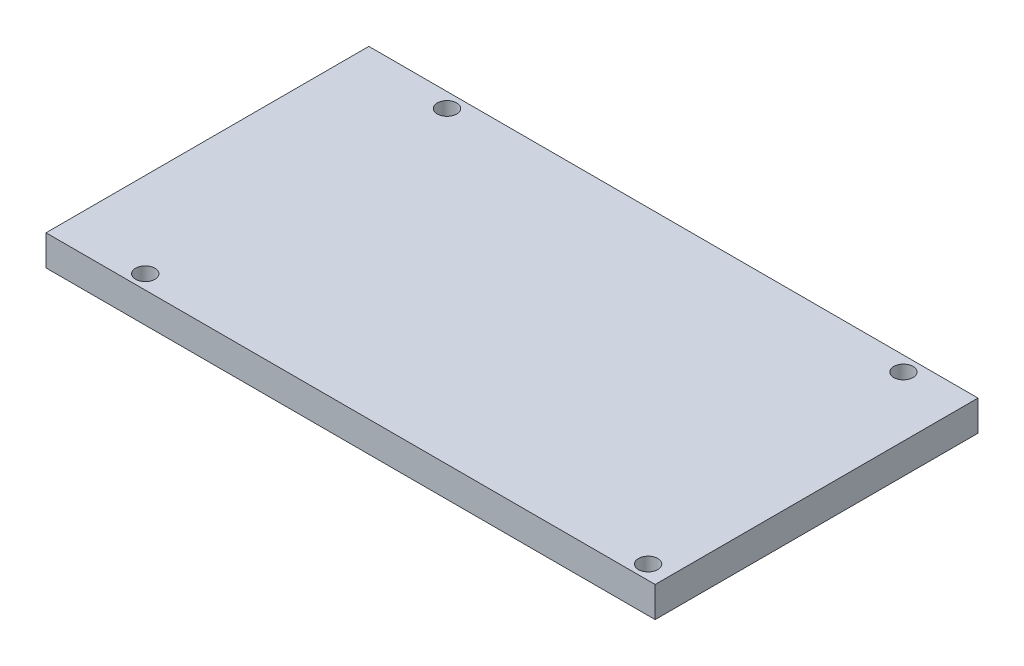
ISO-10303-21;
HEADER;
FILE_DESCRIPTION(('STEP AP214'),'2;1');
FILE_NAME('part.step','',(''),(''),'','','');
FILE_SCHEMA(('AUTOMOTIVE_DESIGN { 1 0 10303 214 1 1 1 1 }'));
ENDSEC;
DATA;
#1=APPLICATION_CONTEXT('core data for automotive mechanical design processes');
#2=APPLICATION_PROTOCOL_DEFINITION('international standard','automotive_design',2000,#1);
#3=PRODUCT_CONTEXT('',#1,'mechanical');
#4=PRODUCT('Part','Part','',(#3));
#5=PRODUCT_RELATED_PRODUCT_CATEGORY('part','',(#4));
#6=PRODUCT_DEFINITION_FORMATION('','',#4);
#7=PRODUCT_DEFINITION_CONTEXT('part definition',#1,'design');
#8=PRODUCT_DEFINITION('design','',#6,#7);
#9=PRODUCT_DEFINITION_SHAPE('','',#8);
#10=(LENGTH_UNIT() NAMED_UNIT(*) SI_UNIT(.MILLI.,.METRE.));
#11=(NAMED_UNIT(*) PLANE_ANGLE_UNIT() SI_UNIT($,.RADIAN.));
#12=(NAMED_UNIT(*) SI_UNIT($,.STERADIAN.) SOLID_ANGLE_UNIT());
#13=UNCERTAINTY_MEASURE_WITH_UNIT(LENGTH_MEASURE(1.E-05),#10,'distance_accuracy_value','');
#14=(GEOMETRIC_REPRESENTATION_CONTEXT(3) GLOBAL_UNCERTAINTY_ASSIGNED_CONTEXT((#13)) GLOBAL_UNIT_ASSIGNED_CONTEXT((#10,
#11,#12)) REPRESENTATION_CONTEXT('',''));
#15=CARTESIAN_POINT('',(0.,0.,0.));
#16=DIRECTION('',(0.,0.,1.));
#17=DIRECTION('',(1.,0.,0.));
#18=AXIS2_PLACEMENT_3D('',#15,#16,#17);
#19=CARTESIAN_POINT('',(50.,5.,26.5));
#20=DIRECTION('',(-1.,0.,0.));
#21=DIRECTION('',(0.,0.,1.));
#22=AXIS2_PLACEMENT_3D('',#19,#20,#21);
#23=PLANE('',#22);
#24=DIRECTION('',(0.,0.,-1.));
#25=VECTOR('',#24,1.);
#26=CARTESIAN_POINT('',(50.,0.,26.5));
#27=LINE('',#26,#25);
#28=CARTESIAN_POINT('',(50.,0.,26.5));
#29=VERTEX_POINT('',#28);
#30=CARTESIAN_POINT('',(50.,0.,-26.5));
#31=VERTEX_POINT('',#30);
#32=EDGE_CURVE('E106',#29,#31,#27,.T.);
#33=ORIENTED_EDGE('',*,*,#32,.T.);
#34=DIRECTION('',(0.,-1.,0.));
#35=VECTOR('',#34,1.);
#36=CARTESIAN_POINT('',(50.,5.,-26.5));
#37=LINE('',#36,#35);
#38=CARTESIAN_POINT('',(50.,5.,-26.5));
#39=VERTEX_POINT('',#38);
#40=EDGE_CURVE('E11',#39,#31,#37,.T.);
#41=ORIENTED_EDGE('',*,*,#40,.F.);
#42=DIRECTION('',(0.,0.,-1.));
#43=VECTOR('',#42,1.);
#44=CARTESIAN_POINT('',(50.,5.,26.5));
#45=LINE('',#44,#43);
#46=CARTESIAN_POINT('',(50.,5.,26.5));
#47=VERTEX_POINT('',#46);
#48=EDGE_CURVE('E90',#47,#39,#45,.T.);
#49=ORIENTED_EDGE('',*,*,#48,.F.);
#50=DIRECTION('',(0.,-1.,0.));
#51=VECTOR('',#50,1.);
#52=CARTESIAN_POINT('',(50.,5.,26.5));
#53=LINE('',#52,#51);
#54=EDGE_CURVE('E102',#47,#29,#53,.T.);
#55=ORIENTED_EDGE('',*,*,#54,.T.);
#56=EDGE_LOOP('',(#33,#41,#49,#55));
#57=FACE_BOUND('',#56,.T.);
#58=ADVANCED_FACE('F38',(#57),#23,.F.);
#59=CARTESIAN_POINT('',(-50.,5.,-26.5));
#60=DIRECTION('',(0.,0.,1.));
#61=DIRECTION('',(1.,0.,0.));
#62=AXIS2_PLACEMENT_3D('',#59,#60,#61);
#63=PLANE('',#62);
#64=DIRECTION('',(-1.,0.,0.));
#65=VECTOR('',#64,1.);
#66=CARTESIAN_POINT('',(-50.,0.,-26.5));
#67=LINE('',#66,#65);
#68=CARTESIAN_POINT('',(-50.,0.,-26.5));
#69=VERTEX_POINT('',#68);
#70=EDGE_CURVE('E95',#31,#69,#67,.T.);
#71=ORIENTED_EDGE('',*,*,#70,.T.);
#72=DIRECTION('',(0.,-1.,0.));
#73=VECTOR('',#72,1.);
#74=CARTESIAN_POINT('',(-50.,5.,-26.5));
#75=LINE('',#74,#73);
#76=CARTESIAN_POINT('',(-50.,5.,-26.5));
#77=VERTEX_POINT('',#76);
#78=EDGE_CURVE('E47',#77,#69,#75,.T.);
#79=ORIENTED_EDGE('',*,*,#78,.F.);
#80=DIRECTION('',(-1.,0.,0.));
#81=VECTOR('',#80,1.);
#82=CARTESIAN_POINT('',(-50.,5.,-26.5));
#83=LINE('',#82,#81);
#84=EDGE_CURVE('E85',#39,#77,#83,.T.);
#85=ORIENTED_EDGE('',*,*,#84,.F.);
#86=ORIENTED_EDGE('',*,*,#40,.T.);
#87=EDGE_LOOP('',(#71,#79,#85,#86));
#88=FACE_BOUND('',#87,.T.);
#89=ADVANCED_FACE('F94',(#88),#63,.F.);
#90=CARTESIAN_POINT('',(-50.,5.,26.5));
#91=DIRECTION('',(1.,0.,0.));
#92=DIRECTION('',(0.,0.,-1.));
#93=AXIS2_PLACEMENT_3D('',#90,#91,#92);
#94=PLANE('',#93);
#95=DIRECTION('',(0.,0.,1.));
#96=VECTOR('',#95,1.);
#97=CARTESIAN_POINT('',(-50.,0.,26.5));
#98=LINE('',#97,#96);
#99=CARTESIAN_POINT('',(-50.,0.,26.5));
#100=VERTEX_POINT('',#99);
#101=EDGE_CURVE('E72',#69,#100,#98,.T.);
#102=ORIENTED_EDGE('',*,*,#101,.T.);
#103=DIRECTION('',(0.,-1.,0.));
#104=VECTOR('',#103,1.);
#105=CARTESIAN_POINT('',(-50.,5.,26.5));
#106=LINE('',#105,#104);
#107=CARTESIAN_POINT('',(-50.,5.,26.5));
#108=VERTEX_POINT('',#107);
#109=EDGE_CURVE('E97',#108,#100,#106,.T.);
#110=ORIENTED_EDGE('',*,*,#109,.F.);
#111=DIRECTION('',(0.,0.,1.));
#112=VECTOR('',#111,1.);
#113=CARTESIAN_POINT('',(-50.,5.,26.5));
#114=LINE('',#113,#112);
#115=EDGE_CURVE('E88',#77,#108,#114,.T.);
#116=ORIENTED_EDGE('',*,*,#115,.F.);
#117=ORIENTED_EDGE('',*,*,#78,.T.);
#118=EDGE_LOOP('',(#102,#110,#116,#117));
#119=FACE_BOUND('',#118,.T.);
#120=ADVANCED_FACE('F98',(#119),#94,.F.);
#121=CARTESIAN_POINT('',(-50.,5.,26.5));
#122=DIRECTION('',(0.,0.,-1.));
#123=DIRECTION('',(-1.,0.,0.));
#124=AXIS2_PLACEMENT_3D('',#121,#122,#123);
#125=PLANE('',#124);
#126=DIRECTION('',(1.,0.,0.));
#127=VECTOR('',#126,1.);
#128=CARTESIAN_POINT('',(-50.,0.,26.5));
#129=LINE('',#128,#127);
#130=EDGE_CURVE('E78',#100,#29,#129,.T.);
#131=ORIENTED_EDGE('',*,*,#130,.T.);
#132=ORIENTED_EDGE('',*,*,#54,.F.);
#133=DIRECTION('',(1.,0.,0.));
#134=VECTOR('',#133,1.);
#135=CARTESIAN_POINT('',(-50.,5.,26.5));
#136=LINE('',#135,#134);
#137=EDGE_CURVE('E55',#108,#47,#136,.T.);
#138=ORIENTED_EDGE('',*,*,#137,.F.);
#139=ORIENTED_EDGE('',*,*,#109,.T.);
#140=EDGE_LOOP('',(#131,#132,#138,#139));
#141=FACE_BOUND('',#140,.T.);
#142=ADVANCED_FACE('F120',(#141),#125,.F.);
#143=CARTESIAN_POINT('',(0.,5.,0.));
#144=DIRECTION('',(0.,-1.,0.));
#145=DIRECTION('',(0.,0.,-1.));
#146=AXIS2_PLACEMENT_3D('',#143,#144,#145);
#147=PLANE('',#146);
#148=CARTESIAN_POINT('',(46.5199999999999,5.,24.1730000000002));
#149=DIRECTION('',(0.,-1.,0.));
#150=DIRECTION('',(0.,0.,-1.));
#151=AXIS2_PLACEMENT_3D('',#148,#149,#150);
#152=CIRCLE('',#151,1.5875);
#153=CARTESIAN_POINT('',(46.5199999999999,5.,22.5855000000002));
#154=VERTEX_POINT('',#153);
#155=EDGE_CURVE('E110',#154,#154,#152,.T.);
#156=ORIENTED_EDGE('',*,*,#155,.T.);
#157=EDGE_LOOP('',(#156));
#158=FACE_BOUND('',#157,.T.);
#159=CARTESIAN_POINT('',(40.17,5.,-24.0869999999998));
#160=DIRECTION('',(0.,-1.,0.));
#161=DIRECTION('',(0.,0.,-1.));
#162=AXIS2_PLACEMENT_3D('',#159,#160,#161);
#163=CIRCLE('',#162,1.5875);
#164=CARTESIAN_POINT('',(40.17,5.,-25.6744999999998));
#165=VERTEX_POINT('',#164);
#166=EDGE_CURVE('E147',#165,#165,#163,.T.);
#167=ORIENTED_EDGE('',*,*,#166,.T.);
#168=EDGE_LOOP('',(#167));
#169=FACE_BOUND('',#168,.T.);
#170=CARTESIAN_POINT('',(-34.76,5.,-24.087));
#171=DIRECTION('',(0.,-1.,0.));
#172=DIRECTION('',(0.,0.,-1.));
#173=AXIS2_PLACEMENT_3D('',#170,#171,#172);
#174=CIRCLE('',#173,1.5875);
#175=CARTESIAN_POINT('',(-34.76,5.,-25.6745));
#176=VERTEX_POINT('',#175);
#177=EDGE_CURVE('E139',#176,#176,#174,.T.);
#178=ORIENTED_EDGE('',*,*,#177,.T.);
#179=EDGE_LOOP('',(#178));
#180=FACE_BOUND('',#179,.T.);
#181=CARTESIAN_POINT('',(-36.0300000000001,5.,24.173));
#182=DIRECTION('',(0.,-1.,0.));
#183=DIRECTION('',(0.,0.,-1.));
#184=AXIS2_PLACEMENT_3D('',#181,#182,#183);
#185=CIRCLE('',#184,1.5875);
#186=CARTESIAN_POINT('',(-36.0300000000001,5.,22.5855));
#187=VERTEX_POINT('',#186);
#188=EDGE_CURVE('E131',#187,#187,#185,.T.);
#189=ORIENTED_EDGE('',*,*,#188,.T.);
#190=EDGE_LOOP('',(#189));
#191=FACE_BOUND('',#190,.T.);
#192=ORIENTED_EDGE('',*,*,#48,.T.);
#193=ORIENTED_EDGE('',*,*,#84,.T.);
#194=ORIENTED_EDGE('',*,*,#115,.T.);
#195=ORIENTED_EDGE('',*,*,#137,.T.);
#196=EDGE_LOOP('',(#192,#193,#194,#195));
#197=FACE_BOUND('',#196,.T.);
#198=ADVANCED_FACE('F86',(#158,#169,#180,#191,#197),#147,.F.);
#199=CARTESIAN_POINT('',(0.,0.,0.));
#200=DIRECTION('',(0.,-1.,0.));
#201=DIRECTION('',(0.,0.,-1.));
#202=AXIS2_PLACEMENT_3D('',#199,#200,#201);
#203=PLANE('',#202);
#204=CARTESIAN_POINT('',(46.5199999999999,0.,24.1730000000002));
#205=DIRECTION('',(0.,-1.,0.));
#206=DIRECTION('',(0.,0.,-1.));
#207=AXIS2_PLACEMENT_3D('',#204,#205,#206);
#208=CIRCLE('',#207,1.5875);
#209=CARTESIAN_POINT('',(46.5199999999999,0.,22.5855000000002));
#210=VERTEX_POINT('',#209);
#211=EDGE_CURVE('E151',#210,#210,#208,.T.);
#212=ORIENTED_EDGE('',*,*,#211,.F.);
#213=EDGE_LOOP('',(#212));
#214=FACE_BOUND('',#213,.T.);
#215=CARTESIAN_POINT('',(40.17,0.,-24.0869999999998));
#216=DIRECTION('',(0.,-1.,0.));
#217=DIRECTION('',(0.,0.,-1.));
#218=AXIS2_PLACEMENT_3D('',#215,#216,#217);
#219=CIRCLE('',#218,1.5875);
#220=CARTESIAN_POINT('',(40.17,0.,-25.6744999999998));
#221=VERTEX_POINT('',#220);
#222=EDGE_CURVE('E143',#221,#221,#219,.T.);
#223=ORIENTED_EDGE('',*,*,#222,.F.);
#224=EDGE_LOOP('',(#223));
#225=FACE_BOUND('',#224,.T.);
#226=CARTESIAN_POINT('',(-34.76,0.,-24.087));
#227=DIRECTION('',(0.,-1.,0.));
#228=DIRECTION('',(0.,0.,-1.));
#229=AXIS2_PLACEMENT_3D('',#226,#227,#228);
#230=CIRCLE('',#229,1.5875);
#231=CARTESIAN_POINT('',(-34.76,0.,-25.6745));
#232=VERTEX_POINT('',#231);
#233=EDGE_CURVE('E135',#232,#232,#230,.T.);
#234=ORIENTED_EDGE('',*,*,#233,.F.);
#235=EDGE_LOOP('',(#234));
#236=FACE_BOUND('',#235,.T.);
#237=CARTESIAN_POINT('',(-36.0300000000001,0.,24.173));
#238=DIRECTION('',(0.,-1.,0.));
#239=DIRECTION('',(0.,0.,-1.));
#240=AXIS2_PLACEMENT_3D('',#237,#238,#239);
#241=CIRCLE('',#240,1.5875);
#242=CARTESIAN_POINT('',(-36.0300000000001,0.,22.5855));
#243=VERTEX_POINT('',#242);
#244=EDGE_CURVE('E127',#243,#243,#241,.T.);
#245=ORIENTED_EDGE('',*,*,#244,.F.);
#246=EDGE_LOOP('',(#245));
#247=FACE_BOUND('',#246,.T.);
#248=ORIENTED_EDGE('',*,*,#32,.F.);
#249=ORIENTED_EDGE('',*,*,#130,.F.);
#250=ORIENTED_EDGE('',*,*,#101,.F.);
#251=ORIENTED_EDGE('',*,*,#70,.F.);
#252=EDGE_LOOP('',(#248,#249,#250,#251));
#253=FACE_BOUND('',#252,.T.);
#254=ADVANCED_FACE('F123',(#214,#225,#236,#247,#253),#203,.T.);
#255=CARTESIAN_POINT('',(-36.0300000000001,5.,24.173));
#256=DIRECTION('',(0.,-1.,0.));
#257=DIRECTION('',(0.,0.,-1.));
#258=AXIS2_PLACEMENT_3D('',#255,#256,#257);
#259=CYLINDRICAL_SURFACE('',#258,1.5875);
#260=ORIENTED_EDGE('',*,*,#188,.F.);
#261=EDGE_LOOP('',(#260));
#262=FACE_BOUND('',#261,.T.);
#263=ORIENTED_EDGE('',*,*,#244,.T.);
#264=EDGE_LOOP('',(#263));
#265=FACE_BOUND('',#264,.T.);
#266=ADVANCED_FACE('F170',(#262,#265),#259,.F.);
#267=CARTESIAN_POINT('',(-34.76,5.,-24.087));
#268=DIRECTION('',(0.,-1.,0.));
#269=DIRECTION('',(0.,0.,-1.));
#270=AXIS2_PLACEMENT_3D('',#267,#268,#269);
#271=CYLINDRICAL_SURFACE('',#270,1.5875);
#272=ORIENTED_EDGE('',*,*,#177,.F.);
#273=EDGE_LOOP('',(#272));
#274=FACE_BOUND('',#273,.T.);
#275=ORIENTED_EDGE('',*,*,#233,.T.);
#276=EDGE_LOOP('',(#275));
#277=FACE_BOUND('',#276,.T.);
#278=ADVANCED_FACE('F179',(#274,#277),#271,.F.);
#279=CARTESIAN_POINT('',(40.17,5.,-24.0869999999998));
#280=DIRECTION('',(0.,-1.,0.));
#281=DIRECTION('',(0.,0.,-1.));
#282=AXIS2_PLACEMENT_3D('',#279,#280,#281);
#283=CYLINDRICAL_SURFACE('',#282,1.5875);
#284=ORIENTED_EDGE('',*,*,#166,.F.);
#285=EDGE_LOOP('',(#284));
#286=FACE_BOUND('',#285,.T.);
#287=ORIENTED_EDGE('',*,*,#222,.T.);
#288=EDGE_LOOP('',(#287));
#289=FACE_BOUND('',#288,.T.);
#290=ADVANCED_FACE('F164',(#286,#289),#283,.F.);
#291=CARTESIAN_POINT('',(46.5199999999999,5.,24.1730000000002));
#292=DIRECTION('',(0.,-1.,0.));
#293=DIRECTION('',(0.,0.,-1.));
#294=AXIS2_PLACEMENT_3D('',#291,#292,#293);
#295=CYLINDRICAL_SURFACE('',#294,1.5875);
#296=ORIENTED_EDGE('',*,*,#155,.F.);
#297=EDGE_LOOP('',(#296));
#298=FACE_BOUND('',#297,.T.);
#299=ORIENTED_EDGE('',*,*,#211,.T.);
#300=EDGE_LOOP('',(#299));
#301=FACE_BOUND('',#300,.T.);
#302=ADVANCED_FACE('F161',(#298,#301),#295,.F.);
#303=CLOSED_SHELL('',(#58,#89,#120,#142,#198,#254,#266,#278,#290,#302));
#304=MANIFOLD_SOLID_BREP('B2',#303);
#305=ADVANCED_BREP_SHAPE_REPRESENTATION('',(#18,#304),#14);
#306=SHAPE_DEFINITION_REPRESENTATION(#9,#305);
ENDSEC;
END-ISO-10303-21;
